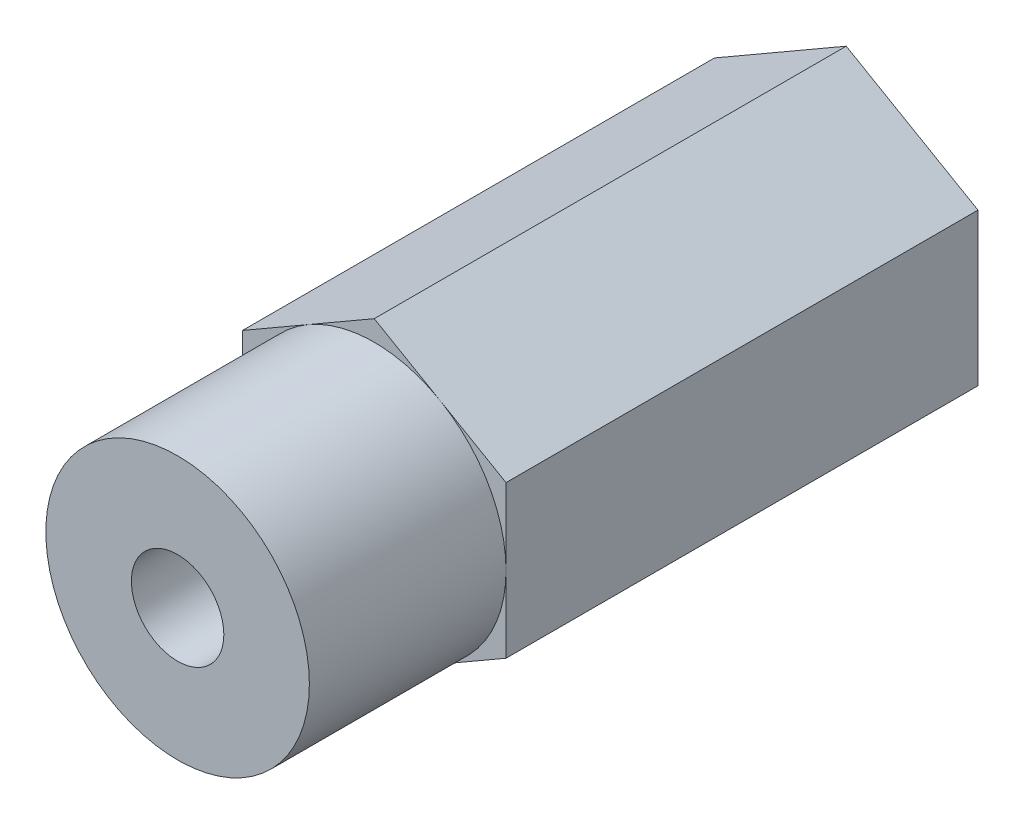
ISO-10303-21;
HEADER;
FILE_DESCRIPTION(('STEP AP214'),'2;1');
FILE_NAME('part.step','',(''),(''),'','','');
FILE_SCHEMA(('AUTOMOTIVE_DESIGN { 1 0 10303 214 1 1 1 1 }'));
ENDSEC;
DATA;
#1=APPLICATION_CONTEXT('core data for automotive mechanical design processes');
#2=APPLICATION_PROTOCOL_DEFINITION('international standard','automotive_design',2000,#1);
#3=PRODUCT_CONTEXT('',#1,'mechanical');
#4=PRODUCT('Part','Part','',(#3));
#5=PRODUCT_RELATED_PRODUCT_CATEGORY('part','',(#4));
#6=PRODUCT_DEFINITION_FORMATION('','',#4);
#7=PRODUCT_DEFINITION_CONTEXT('part definition',#1,'design');
#8=PRODUCT_DEFINITION('design','',#6,#7);
#9=PRODUCT_DEFINITION_SHAPE('','',#8);
#10=(LENGTH_UNIT() NAMED_UNIT(*) SI_UNIT(.MILLI.,.METRE.));
#11=(NAMED_UNIT(*) PLANE_ANGLE_UNIT() SI_UNIT($,.RADIAN.));
#12=(NAMED_UNIT(*) SI_UNIT($,.STERADIAN.) SOLID_ANGLE_UNIT());
#13=UNCERTAINTY_MEASURE_WITH_UNIT(LENGTH_MEASURE(1.E-05),#10,'distance_accuracy_value','');
#14=(GEOMETRIC_REPRESENTATION_CONTEXT(3) GLOBAL_UNCERTAINTY_ASSIGNED_CONTEXT((#13)) GLOBAL_UNIT_ASSIGNED_CONTEXT((#10,
#11,#12)) REPRESENTATION_CONTEXT('',''));
#15=CARTESIAN_POINT('',(0.,0.,0.));
#16=DIRECTION('',(0.,0.,1.));
#17=DIRECTION('',(1.,0.,0.));
#18=AXIS2_PLACEMENT_3D('',#15,#16,#17);
#19=CARTESIAN_POINT('',(-2.01,-1.16047404107115,10.2));
#20=DIRECTION('',(0.5,0.866025403784438,0.));
#21=DIRECTION('',(-0.866025403784439,0.5,0.));
#22=AXIS2_PLACEMENT_3D('',#19,#20,#21);
#23=PLANE('',#22);
#24=DIRECTION('',(0.866025403784439,-0.5,0.));
#25=VECTOR('',#24,1.);
#26=CARTESIAN_POINT('',(-2.01,-1.16047404107115,7.2));
#27=LINE('',#26,#25);
#28=CARTESIAN_POINT('',(-2.01,-1.16047404107115,7.2));
#29=VERTEX_POINT('',#28);
#30=CARTESIAN_POINT('',(-1.005,-1.74071106160672,7.2));
#31=VERTEX_POINT('',#30);
#32=EDGE_CURVE('E149',#29,#31,#27,.T.);
#33=ORIENTED_EDGE('',*,*,#32,.F.);
#34=DIRECTION('',(0.,0.,-1.));
#35=VECTOR('',#34,1.);
#36=CARTESIAN_POINT('',(-2.01,-1.16047404107115,10.2));
#37=LINE('',#36,#35);
#38=CARTESIAN_POINT('',(-2.01,-1.16047404107115,0.));
#39=VERTEX_POINT('',#38);
#40=EDGE_CURVE('E57',#29,#39,#37,.T.);
#41=ORIENTED_EDGE('',*,*,#40,.T.);
#42=DIRECTION('',(0.866025403784438,-0.5,0.));
#43=VECTOR('',#42,1.);
#44=CARTESIAN_POINT('',(-2.01,-1.16047404107115,0.));
#45=LINE('',#44,#43);
#46=CARTESIAN_POINT('',(0.,-2.3209480821423,0.));
#47=VERTEX_POINT('',#46);
#48=EDGE_CURVE('E150',#39,#47,#45,.T.);
#49=ORIENTED_EDGE('',*,*,#48,.T.);
#50=DIRECTION('',(0.,0.,-1.));
#51=VECTOR('',#50,1.);
#52=CARTESIAN_POINT('',(0.,-2.3209480821423,10.2));
#53=LINE('',#52,#51);
#54=CARTESIAN_POINT('',(0.,-2.3209480821423,7.2));
#55=VERTEX_POINT('',#54);
#56=EDGE_CURVE('E173',#55,#47,#53,.T.);
#57=ORIENTED_EDGE('',*,*,#56,.F.);
#58=EDGE_CURVE('E147',#31,#55,#27,.T.);
#59=ORIENTED_EDGE('',*,*,#58,.F.);
#60=EDGE_LOOP('',(#33,#41,#49,#57,#59));
#61=FACE_BOUND('',#60,.T.);
#62=ADVANCED_FACE('F35',(#61),#23,.F.);
#63=CARTESIAN_POINT('',(0.,-2.3209480821423,10.2));
#64=DIRECTION('',(-0.5,0.866025403784439,0.));
#65=DIRECTION('',(-0.866025403784439,-0.5,0.));
#66=AXIS2_PLACEMENT_3D('',#63,#64,#65);
#67=PLANE('',#66);
#68=DIRECTION('',(0.866025403784439,0.5,0.));
#69=VECTOR('',#68,1.);
#70=CARTESIAN_POINT('',(0.,-2.3209480821423,7.2));
#71=LINE('',#70,#69);
#72=CARTESIAN_POINT('',(1.005,-1.74071106160672,7.2));
#73=VERTEX_POINT('',#72);
#74=EDGE_CURVE('E146',#55,#73,#71,.T.);
#75=ORIENTED_EDGE('',*,*,#74,.F.);
#76=ORIENTED_EDGE('',*,*,#56,.T.);
#77=DIRECTION('',(0.866025403784439,0.5,0.));
#78=VECTOR('',#77,1.);
#79=CARTESIAN_POINT('',(0.,-2.3209480821423,0.));
#80=LINE('',#79,#78);
#81=CARTESIAN_POINT('',(2.01,-1.16047404107115,0.));
#82=VERTEX_POINT('',#81);
#83=EDGE_CURVE('E152',#47,#82,#80,.T.);
#84=ORIENTED_EDGE('',*,*,#83,.T.);
#85=DIRECTION('',(0.,0.,-1.));
#86=VECTOR('',#85,1.);
#87=CARTESIAN_POINT('',(2.01,-1.16047404107115,10.2));
#88=LINE('',#87,#86);
#89=CARTESIAN_POINT('',(2.01,-1.16047404107115,7.2));
#90=VERTEX_POINT('',#89);
#91=EDGE_CURVE('E171',#90,#82,#88,.T.);
#92=ORIENTED_EDGE('',*,*,#91,.F.);
#93=EDGE_CURVE('E115',#73,#90,#71,.T.);
#94=ORIENTED_EDGE('',*,*,#93,.F.);
#95=EDGE_LOOP('',(#75,#76,#84,#92,#94));
#96=FACE_BOUND('',#95,.T.);
#97=ADVANCED_FACE('F197',(#96),#67,.F.);
#98=CARTESIAN_POINT('',(2.01,-1.16047404107115,10.2));
#99=DIRECTION('',(-1.,0.,0.));
#100=DIRECTION('',(0.,0.,1.));
#101=AXIS2_PLACEMENT_3D('',#98,#99,#100);
#102=PLANE('',#101);
#103=DIRECTION('',(0.,1.,0.));
#104=VECTOR('',#103,1.);
#105=CARTESIAN_POINT('',(2.01,-1.16047404107115,7.2));
#106=LINE('',#105,#104);
#107=CARTESIAN_POINT('',(2.01,0.,7.2));
#108=VERTEX_POINT('',#107);
#109=EDGE_CURVE('E109',#90,#108,#106,.T.);
#110=ORIENTED_EDGE('',*,*,#109,.F.);
#111=ORIENTED_EDGE('',*,*,#91,.T.);
#112=DIRECTION('',(0.,1.,0.));
#113=VECTOR('',#112,1.);
#114=CARTESIAN_POINT('',(2.01,-1.16047404107115,0.));
#115=LINE('',#114,#113);
#116=CARTESIAN_POINT('',(2.01,1.16047404107115,0.));
#117=VERTEX_POINT('',#116);
#118=EDGE_CURVE('E155',#82,#117,#115,.T.);
#119=ORIENTED_EDGE('',*,*,#118,.T.);
#120=DIRECTION('',(0.,0.,-1.));
#121=VECTOR('',#120,1.);
#122=CARTESIAN_POINT('',(2.01,1.16047404107115,10.2));
#123=LINE('',#122,#121);
#124=CARTESIAN_POINT('',(2.01,1.16047404107115,7.2));
#125=VERTEX_POINT('',#124);
#126=EDGE_CURVE('E140',#125,#117,#123,.T.);
#127=ORIENTED_EDGE('',*,*,#126,.F.);
#128=EDGE_CURVE('E119',#108,#125,#106,.T.);
#129=ORIENTED_EDGE('',*,*,#128,.F.);
#130=EDGE_LOOP('',(#110,#111,#119,#127,#129));
#131=FACE_BOUND('',#130,.T.);
#132=ADVANCED_FACE('F138',(#131),#102,.F.);
#133=CARTESIAN_POINT('',(2.01,1.16047404107115,10.2));
#134=DIRECTION('',(-0.5,-0.866025403784438,0.));
#135=DIRECTION('',(0.866025403784438,-0.5,0.));
#136=AXIS2_PLACEMENT_3D('',#133,#134,#135);
#137=PLANE('',#136);
#138=DIRECTION('',(-0.866025403784438,0.5,0.));
#139=VECTOR('',#138,1.);
#140=CARTESIAN_POINT('',(2.01,1.16047404107115,7.2));
#141=LINE('',#140,#139);
#142=CARTESIAN_POINT('',(1.005,1.74071106160672,7.2));
#143=VERTEX_POINT('',#142);
#144=EDGE_CURVE('E133',#125,#143,#141,.T.);
#145=ORIENTED_EDGE('',*,*,#144,.F.);
#146=ORIENTED_EDGE('',*,*,#126,.T.);
#147=DIRECTION('',(-0.866025403784438,0.5,0.));
#148=VECTOR('',#147,1.);
#149=CARTESIAN_POINT('',(2.01,1.16047404107115,0.));
#150=LINE('',#149,#148);
#151=CARTESIAN_POINT('',(0.,2.3209480821423,0.));
#152=VERTEX_POINT('',#151);
#153=EDGE_CURVE('E157',#117,#152,#150,.T.);
#154=ORIENTED_EDGE('',*,*,#153,.T.);
#155=DIRECTION('',(0.,0.,-1.));
#156=VECTOR('',#155,1.);
#157=CARTESIAN_POINT('',(0.,2.3209480821423,10.2));
#158=LINE('',#157,#156);
#159=CARTESIAN_POINT('',(0.,2.3209480821423,7.2));
#160=VERTEX_POINT('',#159);
#161=EDGE_CURVE('E168',#160,#152,#158,.T.);
#162=ORIENTED_EDGE('',*,*,#161,.F.);
#163=EDGE_CURVE('E141',#143,#160,#141,.T.);
#164=ORIENTED_EDGE('',*,*,#163,.F.);
#165=EDGE_LOOP('',(#145,#146,#154,#162,#164));
#166=FACE_BOUND('',#165,.T.);
#167=ADVANCED_FACE('F213',(#166),#137,.F.);
#168=CARTESIAN_POINT('',(0.,2.3209480821423,10.2));
#169=DIRECTION('',(0.5,-0.866025403784439,0.));
#170=DIRECTION('',(0.866025403784439,0.5,0.));
#171=AXIS2_PLACEMENT_3D('',#168,#169,#170);
#172=PLANE('',#171);
#173=DIRECTION('',(-0.866025403784439,-0.5,0.));
#174=VECTOR('',#173,1.);
#175=CARTESIAN_POINT('',(0.,2.3209480821423,7.2));
#176=LINE('',#175,#174);
#177=CARTESIAN_POINT('',(-1.005,1.74071106160672,7.2));
#178=VERTEX_POINT('',#177);
#179=EDGE_CURVE('E203',#160,#178,#176,.T.);
#180=ORIENTED_EDGE('',*,*,#179,.F.);
#181=ORIENTED_EDGE('',*,*,#161,.T.);
#182=DIRECTION('',(-0.866025403784439,-0.5,0.));
#183=VECTOR('',#182,1.);
#184=CARTESIAN_POINT('',(0.,2.3209480821423,0.));
#185=LINE('',#184,#183);
#186=CARTESIAN_POINT('',(-2.01,1.16047404107115,0.));
#187=VERTEX_POINT('',#186);
#188=EDGE_CURVE('E160',#152,#187,#185,.T.);
#189=ORIENTED_EDGE('',*,*,#188,.T.);
#190=DIRECTION('',(0.,0.,-1.));
#191=VECTOR('',#190,1.);
#192=CARTESIAN_POINT('',(-2.01,1.16047404107115,10.2));
#193=LINE('',#192,#191);
#194=CARTESIAN_POINT('',(-2.01,1.16047404107115,7.2));
#195=VERTEX_POINT('',#194);
#196=EDGE_CURVE('E166',#195,#187,#193,.T.);
#197=ORIENTED_EDGE('',*,*,#196,.F.);
#198=EDGE_CURVE('E135',#178,#195,#176,.T.);
#199=ORIENTED_EDGE('',*,*,#198,.F.);
#200=EDGE_LOOP('',(#180,#181,#189,#197,#199));
#201=FACE_BOUND('',#200,.T.);
#202=ADVANCED_FACE('F212',(#201),#172,.F.);
#203=CARTESIAN_POINT('',(-2.01,1.16047404107115,10.2));
#204=DIRECTION('',(1.,0.,0.));
#205=DIRECTION('',(0.,1.,0.));
#206=AXIS2_PLACEMENT_3D('',#203,#204,#205);
#207=PLANE('',#206);
#208=DIRECTION('',(0.,-1.,0.));
#209=VECTOR('',#208,1.);
#210=CARTESIAN_POINT('',(-2.01,1.16047404107115,7.2));
#211=LINE('',#210,#209);
#212=CARTESIAN_POINT('',(-2.01,0.,7.2));
#213=VERTEX_POINT('',#212);
#214=EDGE_CURVE('E11',#195,#213,#211,.T.);
#215=ORIENTED_EDGE('',*,*,#214,.F.);
#216=ORIENTED_EDGE('',*,*,#196,.T.);
#217=DIRECTION('',(0.,-1.,0.));
#218=VECTOR('',#217,1.);
#219=CARTESIAN_POINT('',(-2.01,1.16047404107115,0.));
#220=LINE('',#219,#218);
#221=EDGE_CURVE('E163',#187,#39,#220,.T.);
#222=ORIENTED_EDGE('',*,*,#221,.T.);
#223=ORIENTED_EDGE('',*,*,#40,.F.);
#224=EDGE_CURVE('E38',#213,#29,#211,.T.);
#225=ORIENTED_EDGE('',*,*,#224,.F.);
#226=EDGE_LOOP('',(#215,#216,#222,#223,#225));
#227=FACE_BOUND('',#226,.T.);
#228=ADVANCED_FACE('F186',(#227),#207,.F.);
#229=CARTESIAN_POINT('',(0.,0.,0.));
#230=DIRECTION('',(0.,0.,1.));
#231=DIRECTION('',(1.,0.,0.));
#232=AXIS2_PLACEMENT_3D('',#229,#230,#231);
#233=PLANE('',#232);
#234=ORIENTED_EDGE('',*,*,#48,.F.);
#235=ORIENTED_EDGE('',*,*,#221,.F.);
#236=ORIENTED_EDGE('',*,*,#188,.F.);
#237=ORIENTED_EDGE('',*,*,#153,.F.);
#238=ORIENTED_EDGE('',*,*,#118,.F.);
#239=ORIENTED_EDGE('',*,*,#83,.F.);
#240=EDGE_LOOP('',(#234,#235,#236,#237,#238,#239));
#241=FACE_BOUND('',#240,.T.);
#242=ADVANCED_FACE('F193',(#241),#233,.F.);
#243=CARTESIAN_POINT('',(0.,0.,7.2));
#244=DIRECTION('',(0.,0.,1.));
#245=DIRECTION('',(1.,0.,0.));
#246=AXIS2_PLACEMENT_3D('',#243,#244,#245);
#247=PLANE('',#246);
#248=ORIENTED_EDGE('',*,*,#32,.T.);
#249=CARTESIAN_POINT('',(0.,0.,7.2));
#250=DIRECTION('',(0.,0.,1.));
#251=DIRECTION('',(1.,0.,0.));
#252=AXIS2_PLACEMENT_3D('',#249,#250,#251);
#253=CIRCLE('',#252,2.01);
#254=EDGE_CURVE('E181',#213,#31,#253,.T.);
#255=ORIENTED_EDGE('',*,*,#254,.F.);
#256=ORIENTED_EDGE('',*,*,#224,.T.);
#257=EDGE_LOOP('',(#248,#255,#256));
#258=FACE_BOUND('',#257,.T.);
#259=ADVANCED_FACE('F180',(#258),#247,.T.);
#260=ORIENTED_EDGE('',*,*,#58,.T.);
#261=ORIENTED_EDGE('',*,*,#74,.T.);
#262=EDGE_CURVE('E127',#31,#73,#253,.T.);
#263=ORIENTED_EDGE('',*,*,#262,.F.);
#264=EDGE_LOOP('',(#260,#261,#263));
#265=FACE_BOUND('',#264,.T.);
#266=ADVANCED_FACE('F199',(#265),#247,.T.);
#267=ORIENTED_EDGE('',*,*,#93,.T.);
#268=ORIENTED_EDGE('',*,*,#109,.T.);
#269=EDGE_CURVE('E112',#73,#108,#253,.T.);
#270=ORIENTED_EDGE('',*,*,#269,.F.);
#271=EDGE_LOOP('',(#267,#268,#270));
#272=FACE_BOUND('',#271,.T.);
#273=ADVANCED_FACE('F111',(#272),#247,.T.);
#274=ORIENTED_EDGE('',*,*,#128,.T.);
#275=ORIENTED_EDGE('',*,*,#144,.T.);
#276=EDGE_CURVE('E124',#108,#143,#253,.T.);
#277=ORIENTED_EDGE('',*,*,#276,.F.);
#278=EDGE_LOOP('',(#274,#275,#277));
#279=FACE_BOUND('',#278,.T.);
#280=ADVANCED_FACE('F131',(#279),#247,.T.);
#281=ORIENTED_EDGE('',*,*,#163,.T.);
#282=ORIENTED_EDGE('',*,*,#179,.T.);
#283=EDGE_CURVE('E136',#143,#178,#253,.T.);
#284=ORIENTED_EDGE('',*,*,#283,.F.);
#285=EDGE_LOOP('',(#281,#282,#284));
#286=FACE_BOUND('',#285,.T.);
#287=ADVANCED_FACE('F208',(#286),#247,.T.);
#288=ORIENTED_EDGE('',*,*,#198,.T.);
#289=ORIENTED_EDGE('',*,*,#214,.T.);
#290=EDGE_CURVE('E49',#178,#213,#253,.T.);
#291=ORIENTED_EDGE('',*,*,#290,.F.);
#292=EDGE_LOOP('',(#288,#289,#291));
#293=FACE_BOUND('',#292,.T.);
#294=ADVANCED_FACE('F263',(#293),#247,.T.);
#295=CARTESIAN_POINT('',(0.,0.,7.2));
#296=DIRECTION('',(0.,0.,1.));
#297=DIRECTION('',(1.,0.,0.));
#298=AXIS2_PLACEMENT_3D('',#295,#296,#297);
#299=CYLINDRICAL_SURFACE('',#298,2.01);
#300=CARTESIAN_POINT('',(0.,0.,10.2));
#301=DIRECTION('',(0.,0.,1.));
#302=DIRECTION('',(1.,0.,0.));
#303=AXIS2_PLACEMENT_3D('',#300,#301,#302);
#304=CIRCLE('',#303,2.01);
#305=CARTESIAN_POINT('',(2.01,0.,10.2));
#306=VERTEX_POINT('',#305);
#307=EDGE_CURVE('E174',#306,#306,#304,.T.);
#308=ORIENTED_EDGE('',*,*,#307,.F.);
#309=EDGE_LOOP('',(#308));
#310=FACE_BOUND('',#309,.T.);
#311=ORIENTED_EDGE('',*,*,#254,.T.);
#312=ORIENTED_EDGE('',*,*,#262,.T.);
#313=ORIENTED_EDGE('',*,*,#269,.T.);
#314=ORIENTED_EDGE('',*,*,#276,.T.);
#315=ORIENTED_EDGE('',*,*,#283,.T.);
#316=ORIENTED_EDGE('',*,*,#290,.T.);
#317=EDGE_LOOP('',(#311,#312,#313,#314,#315,#316));
#318=FACE_BOUND('',#317,.T.);
#319=ADVANCED_FACE('F123',(#310,#318),#299,.T.);
#320=CARTESIAN_POINT('',(0.,0.,10.2));
#321=DIRECTION('',(0.,0.,1.));
#322=DIRECTION('',(1.,0.,0.));
#323=AXIS2_PLACEMENT_3D('',#320,#321,#322);
#324=PLANE('',#323);
#325=CARTESIAN_POINT('',(0.,0.,10.2));
#326=DIRECTION('',(0.,0.,1.));
#327=DIRECTION('',(1.,0.,0.));
#328=AXIS2_PLACEMENT_3D('',#325,#326,#327);
#329=CIRCLE('',#328,0.705);
#330=CARTESIAN_POINT('',(0.705,0.,10.2));
#331=VERTEX_POINT('',#330);
#332=EDGE_CURVE('E201',#331,#331,#329,.T.);
#333=ORIENTED_EDGE('',*,*,#332,.F.);
#334=EDGE_LOOP('',(#333));
#335=FACE_BOUND('',#334,.T.);
#336=ORIENTED_EDGE('',*,*,#307,.T.);
#337=EDGE_LOOP('',(#336));
#338=FACE_BOUND('',#337,.T.);
#339=ADVANCED_FACE('F307',(#335,#338),#324,.T.);
#340=CARTESIAN_POINT('',(0.,0.,3.2));
#341=DIRECTION('',(0.,0.,1.));
#342=DIRECTION('',(1.,0.,0.));
#343=AXIS2_PLACEMENT_3D('',#340,#341,#342);
#344=CYLINDRICAL_SURFACE('',#343,0.705);
#345=CARTESIAN_POINT('',(0.,0.,3.2));
#346=DIRECTION('',(0.,0.,1.));
#347=DIRECTION('',(1.,0.,0.));
#348=AXIS2_PLACEMENT_3D('',#345,#346,#347);
#349=CIRCLE('',#348,0.705);
#350=CARTESIAN_POINT('',(0.705,0.,3.2));
#351=VERTEX_POINT('',#350);
#352=EDGE_CURVE('E128',#351,#351,#349,.T.);
#353=ORIENTED_EDGE('',*,*,#352,.F.);
#354=EDGE_LOOP('',(#353));
#355=FACE_BOUND('',#354,.T.);
#356=ORIENTED_EDGE('',*,*,#332,.T.);
#357=EDGE_LOOP('',(#356));
#358=FACE_BOUND('',#357,.T.);
#359=ADVANCED_FACE('F317',(#355,#358),#344,.F.);
#360=CARTESIAN_POINT('',(0.,0.,3.2));
#361=DIRECTION('',(0.,0.,1.));
#362=DIRECTION('',(1.,0.,0.));
#363=AXIS2_PLACEMENT_3D('',#360,#361,#362);
#364=PLANE('',#363);
#365=ORIENTED_EDGE('',*,*,#352,.T.);
#366=EDGE_LOOP('',(#365));
#367=FACE_BOUND('',#366,.T.);
#368=ADVANCED_FACE('F327',(#367),#364,.T.);
#369=CLOSED_SHELL('',(#62,#97,#132,#167,#202,#228,#242,#259,#266,#273,#280,#287,#294,#319,#339,
#359,#368));
#370=MANIFOLD_SOLID_BREP('B2',#369);
#371=ADVANCED_BREP_SHAPE_REPRESENTATION('',(#18,#370),#14);
#372=SHAPE_DEFINITION_REPRESENTATION(#9,#371);
ENDSEC;
END-ISO-10303-21;
